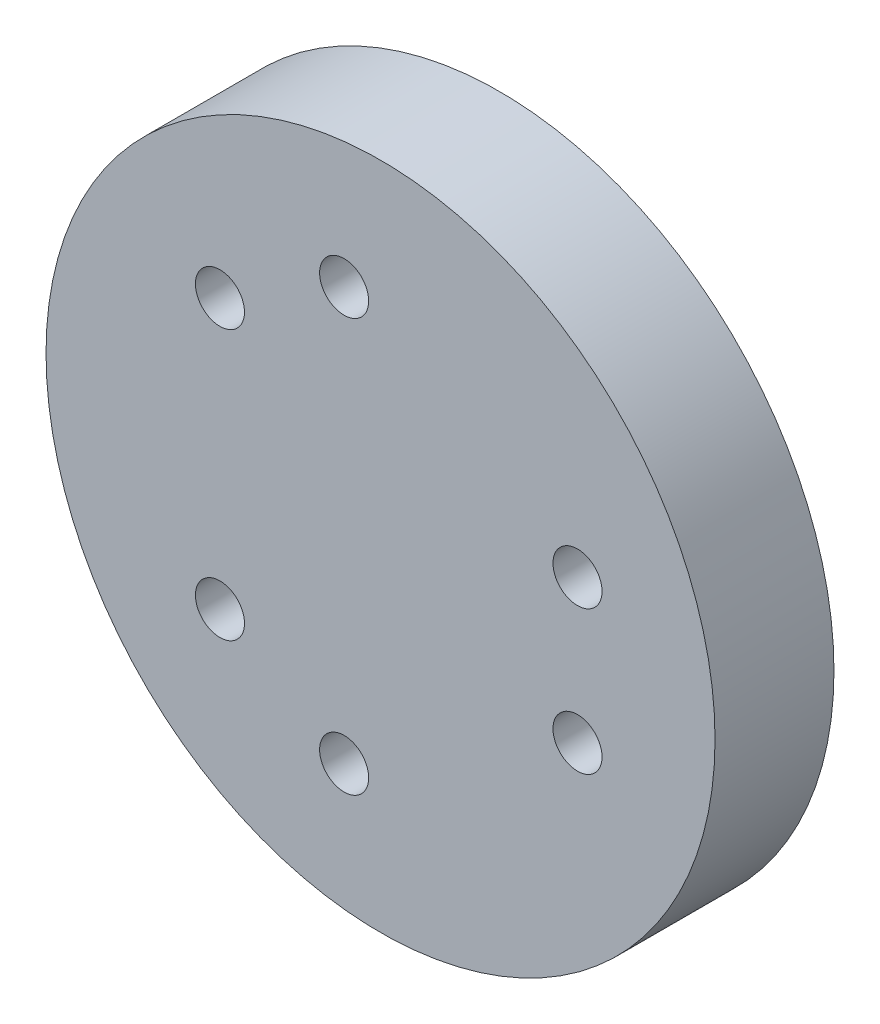
ISO-10303-21;
HEADER;
FILE_DESCRIPTION(('STEP AP214'),'2;1');
FILE_NAME('part.step','',(''),(''),'','','');
FILE_SCHEMA(('AUTOMOTIVE_DESIGN { 1 0 10303 214 1 1 1 1 }'));
ENDSEC;
DATA;
#1=APPLICATION_CONTEXT('core data for automotive mechanical design processes');
#2=APPLICATION_PROTOCOL_DEFINITION('international standard','automotive_design',2000,#1);
#3=PRODUCT_CONTEXT('',#1,'mechanical');
#4=PRODUCT('Part','Part','',(#3));
#5=PRODUCT_RELATED_PRODUCT_CATEGORY('part','',(#4));
#6=PRODUCT_DEFINITION_FORMATION('','',#4);
#7=PRODUCT_DEFINITION_CONTEXT('part definition',#1,'design');
#8=PRODUCT_DEFINITION('design','',#6,#7);
#9=PRODUCT_DEFINITION_SHAPE('','',#8);
#10=(LENGTH_UNIT() NAMED_UNIT(*) SI_UNIT(.MILLI.,.METRE.));
#11=(NAMED_UNIT(*) PLANE_ANGLE_UNIT() SI_UNIT($,.RADIAN.));
#12=(NAMED_UNIT(*) SI_UNIT($,.STERADIAN.) SOLID_ANGLE_UNIT());
#13=UNCERTAINTY_MEASURE_WITH_UNIT(LENGTH_MEASURE(1.E-05),#10,'distance_accuracy_value','');
#14=(GEOMETRIC_REPRESENTATION_CONTEXT(3) GLOBAL_UNCERTAINTY_ASSIGNED_CONTEXT((#13)) GLOBAL_UNIT_ASSIGNED_CONTEXT((#10,
#11,#12)) REPRESENTATION_CONTEXT('',''));
#15=CARTESIAN_POINT('',(0.,0.,0.));
#16=DIRECTION('',(0.,0.,1.));
#17=DIRECTION('',(1.,0.,0.));
#18=AXIS2_PLACEMENT_3D('',#15,#16,#17);
#19=CARTESIAN_POINT('',(0.,0.,10.));
#20=DIRECTION('',(0.,0.,-1.));
#21=DIRECTION('',(-1.,0.,0.));
#22=AXIS2_PLACEMENT_3D('',#19,#20,#21);
#23=CYLINDRICAL_SURFACE('',#22,22.5);
#24=CARTESIAN_POINT('',(0.,0.,10.));
#25=DIRECTION('',(0.,0.,1.));
#26=DIRECTION('',(1.,0.,0.));
#27=AXIS2_PLACEMENT_3D('',#24,#25,#26);
#28=CIRCLE('',#27,22.5);
#29=CARTESIAN_POINT('',(22.5,0.,10.));
#30=VERTEX_POINT('',#29);
#31=EDGE_CURVE('E10',#30,#30,#28,.T.);
#32=ORIENTED_EDGE('',*,*,#31,.F.);
#33=EDGE_LOOP('',(#32));
#34=FACE_BOUND('',#33,.T.);
#35=CARTESIAN_POINT('',(0.,0.,2.));
#36=DIRECTION('',(0.,0.,-1.));
#37=DIRECTION('',(-1.,0.,0.));
#38=AXIS2_PLACEMENT_3D('',#35,#36,#37);
#39=CIRCLE('',#38,22.5);
#40=CARTESIAN_POINT('',(-22.5,0.,2.));
#41=VERTEX_POINT('',#40);
#42=EDGE_CURVE('E140',#41,#41,#39,.T.);
#43=ORIENTED_EDGE('',*,*,#42,.F.);
#44=EDGE_LOOP('',(#43));
#45=FACE_BOUND('',#44,.T.);
#46=ADVANCED_FACE('F31',(#34,#45),#23,.T.);
#47=CARTESIAN_POINT('',(-2.44843930510373,13.8857893174721,7.));
#48=DIRECTION('',(0.,0.,-1.));
#49=DIRECTION('',(-1.,0.,0.));
#50=AXIS2_PLACEMENT_3D('',#47,#48,#49);
#51=CYLINDRICAL_SURFACE('',#50,3.);
#52=CARTESIAN_POINT('',(-2.44843930510373,13.8857893174721,7.));
#53=DIRECTION('',(0.,0.,-1.));
#54=DIRECTION('',(-1.,0.,0.));
#55=AXIS2_PLACEMENT_3D('',#52,#53,#54);
#56=CIRCLE('',#55,3.);
#57=CARTESIAN_POINT('',(-5.44843930510373,13.8857893174721,7.));
#58=VERTEX_POINT('',#57);
#59=EDGE_CURVE('E51',#58,#58,#56,.T.);
#60=ORIENTED_EDGE('',*,*,#59,.F.);
#61=EDGE_LOOP('',(#60));
#62=FACE_BOUND('',#61,.T.);
#63=CARTESIAN_POINT('',(-2.44843930510373,13.8857893174721,2.));
#64=DIRECTION('',(0.,0.,-1.));
#65=DIRECTION('',(-1.,0.,0.));
#66=AXIS2_PLACEMENT_3D('',#63,#64,#65);
#67=CIRCLE('',#66,3.);
#68=CARTESIAN_POINT('',(-5.44843930510373,13.8857893174721,2.));
#69=VERTEX_POINT('',#68);
#70=EDGE_CURVE('E147',#69,#69,#67,.T.);
#71=ORIENTED_EDGE('',*,*,#70,.T.);
#72=EDGE_LOOP('',(#71));
#73=FACE_BOUND('',#72,.T.);
#74=ADVANCED_FACE('F240',(#62,#73),#51,.F.);
#75=CARTESIAN_POINT('',(-2.44843930510205,-13.8857893174715,7.));
#76=DIRECTION('',(0.,0.,-1.));
#77=DIRECTION('',(-1.,0.,0.));
#78=AXIS2_PLACEMENT_3D('',#75,#76,#77);
#79=CYLINDRICAL_SURFACE('',#78,3.);
#80=CARTESIAN_POINT('',(-2.44843930510205,-13.8857893174715,7.));
#81=DIRECTION('',(0.,0.,-1.));
#82=DIRECTION('',(-1.,0.,0.));
#83=AXIS2_PLACEMENT_3D('',#80,#81,#82);
#84=CIRCLE('',#83,3.);
#85=CARTESIAN_POINT('',(-5.44843930510205,-13.8857893174715,7.));
#86=VERTEX_POINT('',#85);
#87=EDGE_CURVE('E115',#86,#86,#84,.T.);
#88=ORIENTED_EDGE('',*,*,#87,.F.);
#89=EDGE_LOOP('',(#88));
#90=FACE_BOUND('',#89,.T.);
#91=CARTESIAN_POINT('',(-2.44843930510205,-13.8857893174715,2.));
#92=DIRECTION('',(0.,0.,-1.));
#93=DIRECTION('',(-1.,0.,0.));
#94=AXIS2_PLACEMENT_3D('',#91,#92,#93);
#95=CIRCLE('',#94,3.);
#96=CARTESIAN_POINT('',(-5.44843930510205,-13.8857893174715,2.));
#97=VERTEX_POINT('',#96);
#98=EDGE_CURVE('E162',#97,#97,#95,.T.);
#99=ORIENTED_EDGE('',*,*,#98,.T.);
#100=EDGE_LOOP('',(#99));
#101=FACE_BOUND('',#100,.T.);
#102=ADVANCED_FACE('F245',(#90,#101),#79,.F.);
#103=CARTESIAN_POINT('',(-10.801226647976,-9.06330529657962,7.));
#104=DIRECTION('',(0.,0.,-1.));
#105=DIRECTION('',(-1.,0.,0.));
#106=AXIS2_PLACEMENT_3D('',#103,#104,#105);
#107=CYLINDRICAL_SURFACE('',#106,3.);
#108=CARTESIAN_POINT('',(-10.801226647976,-9.06330529657962,7.));
#109=DIRECTION('',(0.,0.,-1.));
#110=DIRECTION('',(-1.,0.,0.));
#111=AXIS2_PLACEMENT_3D('',#108,#109,#110);
#112=CIRCLE('',#111,3.);
#113=CARTESIAN_POINT('',(-13.801226647976,-9.06330529657962,7.));
#114=VERTEX_POINT('',#113);
#115=EDGE_CURVE('E117',#114,#114,#112,.T.);
#116=ORIENTED_EDGE('',*,*,#115,.F.);
#117=EDGE_LOOP('',(#116));
#118=FACE_BOUND('',#117,.T.);
#119=CARTESIAN_POINT('',(-10.801226647976,-9.06330529657962,2.));
#120=DIRECTION('',(0.,0.,-1.));
#121=DIRECTION('',(-1.,0.,0.));
#122=AXIS2_PLACEMENT_3D('',#119,#120,#121);
#123=CIRCLE('',#122,3.);
#124=CARTESIAN_POINT('',(-13.801226647976,-9.06330529657962,2.));
#125=VERTEX_POINT('',#124);
#126=EDGE_CURVE('E159',#125,#125,#123,.T.);
#127=ORIENTED_EDGE('',*,*,#126,.T.);
#128=EDGE_LOOP('',(#127));
#129=FACE_BOUND('',#128,.T.);
#130=ADVANCED_FACE('F251',(#118,#129),#107,.F.);
#131=CARTESIAN_POINT('',(13.2496659530816,4.82248402089367,7.));
#132=DIRECTION('',(0.,0.,-1.));
#133=DIRECTION('',(-1.,0.,0.));
#134=AXIS2_PLACEMENT_3D('',#131,#132,#133);
#135=CYLINDRICAL_SURFACE('',#134,3.);
#136=CARTESIAN_POINT('',(13.2496659530816,4.82248402089367,7.));
#137=DIRECTION('',(0.,0.,-1.));
#138=DIRECTION('',(-1.,0.,0.));
#139=AXIS2_PLACEMENT_3D('',#136,#137,#138);
#140=CIRCLE('',#139,3.);
#141=CARTESIAN_POINT('',(10.2496659530816,4.82248402089367,7.));
#142=VERTEX_POINT('',#141);
#143=EDGE_CURVE('E74',#142,#142,#140,.T.);
#144=ORIENTED_EDGE('',*,*,#143,.F.);
#145=EDGE_LOOP('',(#144));
#146=FACE_BOUND('',#145,.T.);
#147=CARTESIAN_POINT('',(13.2496659530816,4.82248402089367,2.));
#148=DIRECTION('',(0.,0.,-1.));
#149=DIRECTION('',(-1.,0.,0.));
#150=AXIS2_PLACEMENT_3D('',#147,#148,#149);
#151=CIRCLE('',#150,3.);
#152=CARTESIAN_POINT('',(10.2496659530816,4.82248402089367,2.));
#153=VERTEX_POINT('',#152);
#154=EDGE_CURVE('E174',#153,#153,#151,.T.);
#155=ORIENTED_EDGE('',*,*,#154,.T.);
#156=EDGE_LOOP('',(#155));
#157=FACE_BOUND('',#156,.T.);
#158=ADVANCED_FACE('F474',(#146,#157),#135,.F.);
#159=CARTESIAN_POINT('',(13.2496659530816,-4.82248402089022,7.));
#160=DIRECTION('',(0.,0.,-1.));
#161=DIRECTION('',(-1.,0.,0.));
#162=AXIS2_PLACEMENT_3D('',#159,#160,#161);
#163=CYLINDRICAL_SURFACE('',#162,3.);
#164=CARTESIAN_POINT('',(13.2496659530816,-4.82248402089022,7.));
#165=DIRECTION('',(0.,0.,-1.));
#166=DIRECTION('',(-1.,0.,0.));
#167=AXIS2_PLACEMENT_3D('',#164,#165,#166);
#168=CIRCLE('',#167,3.);
#169=CARTESIAN_POINT('',(10.2496659530816,-4.82248402089022,7.));
#170=VERTEX_POINT('',#169);
#171=EDGE_CURVE('E118',#170,#170,#168,.T.);
#172=ORIENTED_EDGE('',*,*,#171,.F.);
#173=EDGE_LOOP('',(#172));
#174=FACE_BOUND('',#173,.T.);
#175=CARTESIAN_POINT('',(13.2496659530816,-4.82248402089022,2.));
#176=DIRECTION('',(0.,0.,-1.));
#177=DIRECTION('',(-1.,0.,0.));
#178=AXIS2_PLACEMENT_3D('',#175,#176,#177);
#179=CIRCLE('',#178,3.);
#180=CARTESIAN_POINT('',(10.2496659530816,-4.82248402089022,2.));
#181=VERTEX_POINT('',#180);
#182=EDGE_CURVE('E171',#181,#181,#179,.T.);
#183=ORIENTED_EDGE('',*,*,#182,.T.);
#184=EDGE_LOOP('',(#183));
#185=FACE_BOUND('',#184,.T.);
#186=ADVANCED_FACE('F483',(#174,#185),#163,.F.);
#187=CARTESIAN_POINT('',(-10.8012266479776,9.06330529658017,7.));
#188=DIRECTION('',(0.,0.,-1.));
#189=DIRECTION('',(-1.,0.,0.));
#190=AXIS2_PLACEMENT_3D('',#187,#188,#189);
#191=CYLINDRICAL_SURFACE('',#190,3.);
#192=CARTESIAN_POINT('',(-10.8012266479776,9.06330529658017,7.));
#193=DIRECTION('',(0.,0.,-1.));
#194=DIRECTION('',(-1.,0.,0.));
#195=AXIS2_PLACEMENT_3D('',#192,#193,#194);
#196=CIRCLE('',#195,3.);
#197=CARTESIAN_POINT('',(-13.8012266479776,9.06330529658017,7.));
#198=VERTEX_POINT('',#197);
#199=EDGE_CURVE('E56',#198,#198,#196,.T.);
#200=ORIENTED_EDGE('',*,*,#199,.F.);
#201=EDGE_LOOP('',(#200));
#202=FACE_BOUND('',#201,.T.);
#203=CARTESIAN_POINT('',(-10.8012266479776,9.06330529658017,2.));
#204=DIRECTION('',(0.,0.,-1.));
#205=DIRECTION('',(-1.,0.,0.));
#206=AXIS2_PLACEMENT_3D('',#203,#204,#205);
#207=CIRCLE('',#206,3.);
#208=CARTESIAN_POINT('',(-13.8012266479776,9.06330529658017,2.));
#209=VERTEX_POINT('',#208);
#210=EDGE_CURVE('E150',#209,#209,#207,.T.);
#211=ORIENTED_EDGE('',*,*,#210,.T.);
#212=EDGE_LOOP('',(#211));
#213=FACE_BOUND('',#212,.T.);
#214=ADVANCED_FACE('F270',(#202,#213),#191,.F.);
#215=CARTESIAN_POINT('',(-10.8012266479776,9.06330529658017,10.));
#216=DIRECTION('',(0.,0.,-1.));
#217=DIRECTION('',(-1.,0.,0.));
#218=AXIS2_PLACEMENT_3D('',#215,#216,#217);
#219=CYLINDRICAL_SURFACE('',#218,1.65);
#220=CARTESIAN_POINT('',(-10.8012266479776,9.06330529658017,10.));
#221=DIRECTION('',(0.,0.,1.));
#222=DIRECTION('',(1.,0.,0.));
#223=AXIS2_PLACEMENT_3D('',#220,#221,#222);
#224=CIRCLE('',#223,1.65);
#225=CARTESIAN_POINT('',(-9.15122664797762,9.06330529658017,10.));
#226=VERTEX_POINT('',#225);
#227=EDGE_CURVE('E43',#226,#226,#224,.T.);
#228=ORIENTED_EDGE('',*,*,#227,.T.);
#229=EDGE_LOOP('',(#228));
#230=FACE_BOUND('',#229,.T.);
#231=CARTESIAN_POINT('',(-10.8012266479776,9.06330529658017,7.));
#232=DIRECTION('',(0.,0.,-1.));
#233=DIRECTION('',(-1.,0.,0.));
#234=AXIS2_PLACEMENT_3D('',#231,#232,#233);
#235=CIRCLE('',#234,1.65);
#236=CARTESIAN_POINT('',(-12.4512266479776,9.06330529658017,7.));
#237=VERTEX_POINT('',#236);
#238=EDGE_CURVE('E34',#237,#237,#235,.T.);
#239=ORIENTED_EDGE('',*,*,#238,.T.);
#240=EDGE_LOOP('',(#239));
#241=FACE_BOUND('',#240,.T.);
#242=ADVANCED_FACE('F89',(#230,#241),#219,.F.);
#243=CARTESIAN_POINT('',(13.2496659530816,-4.82248402089022,10.));
#244=DIRECTION('',(0.,0.,-1.));
#245=DIRECTION('',(-1.,0.,0.));
#246=AXIS2_PLACEMENT_3D('',#243,#244,#245);
#247=CYLINDRICAL_SURFACE('',#246,1.65);
#248=CARTESIAN_POINT('',(13.2496659530816,-4.82248402089022,10.));
#249=DIRECTION('',(0.,0.,1.));
#250=DIRECTION('',(1.,0.,0.));
#251=AXIS2_PLACEMENT_3D('',#248,#249,#250);
#252=CIRCLE('',#251,1.65);
#253=CARTESIAN_POINT('',(14.8996659530816,-4.82248402089022,10.));
#254=VERTEX_POINT('',#253);
#255=EDGE_CURVE('E84',#254,#254,#252,.T.);
#256=ORIENTED_EDGE('',*,*,#255,.T.);
#257=EDGE_LOOP('',(#256));
#258=FACE_BOUND('',#257,.T.);
#259=CARTESIAN_POINT('',(13.2496659530816,-4.82248402089022,7.));
#260=DIRECTION('',(0.,0.,-1.));
#261=DIRECTION('',(-1.,0.,0.));
#262=AXIS2_PLACEMENT_3D('',#259,#260,#261);
#263=CIRCLE('',#262,1.65);
#264=CARTESIAN_POINT('',(11.5996659530816,-4.82248402089022,7.));
#265=VERTEX_POINT('',#264);
#266=EDGE_CURVE('E61',#265,#265,#263,.T.);
#267=ORIENTED_EDGE('',*,*,#266,.T.);
#268=EDGE_LOOP('',(#267));
#269=FACE_BOUND('',#268,.T.);
#270=ADVANCED_FACE('F263',(#258,#269),#247,.F.);
#271=CARTESIAN_POINT('',(13.2496659530816,4.82248402089367,10.));
#272=DIRECTION('',(0.,0.,-1.));
#273=DIRECTION('',(-1.,0.,0.));
#274=AXIS2_PLACEMENT_3D('',#271,#272,#273);
#275=CYLINDRICAL_SURFACE('',#274,1.65);
#276=CARTESIAN_POINT('',(13.2496659530816,4.82248402089367,10.));
#277=DIRECTION('',(0.,0.,1.));
#278=DIRECTION('',(1.,0.,0.));
#279=AXIS2_PLACEMENT_3D('',#276,#277,#278);
#280=CIRCLE('',#279,1.65);
#281=CARTESIAN_POINT('',(14.8996659530816,4.82248402089367,10.));
#282=VERTEX_POINT('',#281);
#283=EDGE_CURVE('E81',#282,#282,#280,.T.);
#284=ORIENTED_EDGE('',*,*,#283,.T.);
#285=EDGE_LOOP('',(#284));
#286=FACE_BOUND('',#285,.T.);
#287=CARTESIAN_POINT('',(13.2496659530816,4.82248402089367,7.));
#288=DIRECTION('',(0.,0.,-1.));
#289=DIRECTION('',(-1.,0.,0.));
#290=AXIS2_PLACEMENT_3D('',#287,#288,#289);
#291=CIRCLE('',#290,1.65);
#292=CARTESIAN_POINT('',(11.5996659530816,4.82248402089367,7.));
#293=VERTEX_POINT('',#292);
#294=EDGE_CURVE('E59',#293,#293,#291,.T.);
#295=ORIENTED_EDGE('',*,*,#294,.T.);
#296=EDGE_LOOP('',(#295));
#297=FACE_BOUND('',#296,.T.);
#298=ADVANCED_FACE('F259',(#286,#297),#275,.F.);
#299=CARTESIAN_POINT('',(-10.801226647976,-9.06330529657962,10.));
#300=DIRECTION('',(0.,0.,-1.));
#301=DIRECTION('',(-1.,0.,0.));
#302=AXIS2_PLACEMENT_3D('',#299,#300,#301);
#303=CYLINDRICAL_SURFACE('',#302,1.65);
#304=CARTESIAN_POINT('',(-10.801226647976,-9.06330529657962,10.));
#305=DIRECTION('',(0.,0.,1.));
#306=DIRECTION('',(1.,0.,0.));
#307=AXIS2_PLACEMENT_3D('',#304,#305,#306);
#308=CIRCLE('',#307,1.65);
#309=CARTESIAN_POINT('',(-9.15122664797596,-9.06330529657962,10.));
#310=VERTEX_POINT('',#309);
#311=EDGE_CURVE('E78',#310,#310,#308,.T.);
#312=ORIENTED_EDGE('',*,*,#311,.T.);
#313=EDGE_LOOP('',(#312));
#314=FACE_BOUND('',#313,.T.);
#315=CARTESIAN_POINT('',(-10.801226647976,-9.06330529657962,7.));
#316=DIRECTION('',(0.,0.,-1.));
#317=DIRECTION('',(-1.,0.,0.));
#318=AXIS2_PLACEMENT_3D('',#315,#316,#317);
#319=CIRCLE('',#318,1.65);
#320=CARTESIAN_POINT('',(-12.451226647976,-9.06330529657962,7.));
#321=VERTEX_POINT('',#320);
#322=EDGE_CURVE('E55',#321,#321,#319,.T.);
#323=ORIENTED_EDGE('',*,*,#322,.T.);
#324=EDGE_LOOP('',(#323));
#325=FACE_BOUND('',#324,.T.);
#326=ADVANCED_FACE('F104',(#314,#325),#303,.F.);
#327=CARTESIAN_POINT('',(-2.44843930510205,-13.8857893174715,10.));
#328=DIRECTION('',(0.,0.,-1.));
#329=DIRECTION('',(-1.,0.,0.));
#330=AXIS2_PLACEMENT_3D('',#327,#328,#329);
#331=CYLINDRICAL_SURFACE('',#330,1.65);
#332=CARTESIAN_POINT('',(-2.44843930510205,-13.8857893174715,10.));
#333=DIRECTION('',(0.,0.,1.));
#334=DIRECTION('',(1.,0.,0.));
#335=AXIS2_PLACEMENT_3D('',#332,#333,#334);
#336=CIRCLE('',#335,1.65);
#337=CARTESIAN_POINT('',(-0.798439305102052,-13.8857893174715,10.));
#338=VERTEX_POINT('',#337);
#339=EDGE_CURVE('E50',#338,#338,#336,.T.);
#340=ORIENTED_EDGE('',*,*,#339,.T.);
#341=EDGE_LOOP('',(#340));
#342=FACE_BOUND('',#341,.T.);
#343=CARTESIAN_POINT('',(-2.44843930510205,-13.8857893174715,7.));
#344=DIRECTION('',(0.,0.,-1.));
#345=DIRECTION('',(-1.,0.,0.));
#346=AXIS2_PLACEMENT_3D('',#343,#344,#345);
#347=CIRCLE('',#346,1.65);
#348=CARTESIAN_POINT('',(-4.09843930510205,-13.8857893174715,7.));
#349=VERTEX_POINT('',#348);
#350=EDGE_CURVE('E52',#349,#349,#347,.T.);
#351=ORIENTED_EDGE('',*,*,#350,.T.);
#352=EDGE_LOOP('',(#351));
#353=FACE_BOUND('',#352,.T.);
#354=ADVANCED_FACE('F101',(#342,#353),#331,.F.);
#355=CARTESIAN_POINT('',(-2.44843930510373,13.8857893174721,10.));
#356=DIRECTION('',(0.,0.,-1.));
#357=DIRECTION('',(-1.,0.,0.));
#358=AXIS2_PLACEMENT_3D('',#355,#356,#357);
#359=CYLINDRICAL_SURFACE('',#358,1.65);
#360=CARTESIAN_POINT('',(-2.44843930510373,13.8857893174721,10.));
#361=DIRECTION('',(0.,0.,1.));
#362=DIRECTION('',(1.,0.,0.));
#363=AXIS2_PLACEMENT_3D('',#360,#361,#362);
#364=CIRCLE('',#363,1.65);
#365=CARTESIAN_POINT('',(-0.798439305103731,13.8857893174721,10.));
#366=VERTEX_POINT('',#365);
#367=EDGE_CURVE('E38',#366,#366,#364,.T.);
#368=ORIENTED_EDGE('',*,*,#367,.T.);
#369=EDGE_LOOP('',(#368));
#370=FACE_BOUND('',#369,.T.);
#371=CARTESIAN_POINT('',(-2.44843930510373,13.8857893174721,7.));
#372=DIRECTION('',(0.,0.,-1.));
#373=DIRECTION('',(-1.,0.,0.));
#374=AXIS2_PLACEMENT_3D('',#371,#372,#373);
#375=CIRCLE('',#374,1.65);
#376=CARTESIAN_POINT('',(-4.09843930510373,13.8857893174721,7.));
#377=VERTEX_POINT('',#376);
#378=EDGE_CURVE('E47',#377,#377,#375,.T.);
#379=ORIENTED_EDGE('',*,*,#378,.T.);
#380=EDGE_LOOP('',(#379));
#381=FACE_BOUND('',#380,.T.);
#382=ADVANCED_FACE('F95',(#370,#381),#359,.F.);
#383=CARTESIAN_POINT('',(0.,0.,10.));
#384=DIRECTION('',(0.,0.,1.));
#385=DIRECTION('',(1.,0.,0.));
#386=AXIS2_PLACEMENT_3D('',#383,#384,#385);
#387=PLANE('',#386);
#388=ORIENTED_EDGE('',*,*,#311,.F.);
#389=EDGE_LOOP('',(#388));
#390=FACE_BOUND('',#389,.T.);
#391=ORIENTED_EDGE('',*,*,#255,.F.);
#392=EDGE_LOOP('',(#391));
#393=FACE_BOUND('',#392,.T.);
#394=ORIENTED_EDGE('',*,*,#367,.F.);
#395=EDGE_LOOP('',(#394));
#396=FACE_BOUND('',#395,.T.);
#397=ORIENTED_EDGE('',*,*,#31,.T.);
#398=EDGE_LOOP('',(#397));
#399=FACE_BOUND('',#398,.T.);
#400=ORIENTED_EDGE('',*,*,#227,.F.);
#401=EDGE_LOOP('',(#400));
#402=FACE_BOUND('',#401,.T.);
#403=ORIENTED_EDGE('',*,*,#283,.F.);
#404=EDGE_LOOP('',(#403));
#405=FACE_BOUND('',#404,.T.);
#406=ORIENTED_EDGE('',*,*,#339,.F.);
#407=EDGE_LOOP('',(#406));
#408=FACE_BOUND('',#407,.T.);
#409=ADVANCED_FACE('F91',(#390,#393,#396,#399,#402,#405,#408),#387,.T.);
#410=CARTESIAN_POINT('',(-2.44843930510373,13.8857893174721,7.));
#411=DIRECTION('',(0.,0.,-1.));
#412=DIRECTION('',(-1.,0.,0.));
#413=AXIS2_PLACEMENT_3D('',#410,#411,#412);
#414=PLANE('',#413);
#415=ORIENTED_EDGE('',*,*,#378,.F.);
#416=EDGE_LOOP('',(#415));
#417=FACE_BOUND('',#416,.T.);
#418=ORIENTED_EDGE('',*,*,#59,.T.);
#419=EDGE_LOOP('',(#418));
#420=FACE_BOUND('',#419,.T.);
#421=ADVANCED_FACE('F94',(#417,#420),#414,.T.);
#422=CARTESIAN_POINT('',(-2.44843930510205,-13.8857893174715,7.));
#423=DIRECTION('',(0.,0.,-1.));
#424=DIRECTION('',(-1.,0.,0.));
#425=AXIS2_PLACEMENT_3D('',#422,#423,#424);
#426=PLANE('',#425);
#427=ORIENTED_EDGE('',*,*,#350,.F.);
#428=EDGE_LOOP('',(#427));
#429=FACE_BOUND('',#428,.T.);
#430=ORIENTED_EDGE('',*,*,#87,.T.);
#431=EDGE_LOOP('',(#430));
#432=FACE_BOUND('',#431,.T.);
#433=ADVANCED_FACE('F108',(#429,#432),#426,.T.);
#434=CARTESIAN_POINT('',(-10.801226647976,-9.06330529657962,7.));
#435=DIRECTION('',(0.,0.,-1.));
#436=DIRECTION('',(-1.,0.,0.));
#437=AXIS2_PLACEMENT_3D('',#434,#435,#436);
#438=PLANE('',#437);
#439=ORIENTED_EDGE('',*,*,#322,.F.);
#440=EDGE_LOOP('',(#439));
#441=FACE_BOUND('',#440,.T.);
#442=ORIENTED_EDGE('',*,*,#115,.T.);
#443=EDGE_LOOP('',(#442));
#444=FACE_BOUND('',#443,.T.);
#445=ADVANCED_FACE('F111',(#441,#444),#438,.T.);
#446=CARTESIAN_POINT('',(13.2496659530816,4.82248402089367,7.));
#447=DIRECTION('',(0.,0.,-1.));
#448=DIRECTION('',(-1.,0.,0.));
#449=AXIS2_PLACEMENT_3D('',#446,#447,#448);
#450=PLANE('',#449);
#451=ORIENTED_EDGE('',*,*,#294,.F.);
#452=EDGE_LOOP('',(#451));
#453=FACE_BOUND('',#452,.T.);
#454=ORIENTED_EDGE('',*,*,#143,.T.);
#455=EDGE_LOOP('',(#454));
#456=FACE_BOUND('',#455,.T.);
#457=ADVANCED_FACE('F294',(#453,#456),#450,.T.);
#458=CARTESIAN_POINT('',(13.2496659530816,-4.82248402089022,7.));
#459=DIRECTION('',(0.,0.,-1.));
#460=DIRECTION('',(-1.,0.,0.));
#461=AXIS2_PLACEMENT_3D('',#458,#459,#460);
#462=PLANE('',#461);
#463=ORIENTED_EDGE('',*,*,#266,.F.);
#464=EDGE_LOOP('',(#463));
#465=FACE_BOUND('',#464,.T.);
#466=ORIENTED_EDGE('',*,*,#171,.T.);
#467=EDGE_LOOP('',(#466));
#468=FACE_BOUND('',#467,.T.);
#469=ADVANCED_FACE('F302',(#465,#468),#462,.T.);
#470=CARTESIAN_POINT('',(-10.8012266479776,9.06330529658017,7.));
#471=DIRECTION('',(0.,0.,-1.));
#472=DIRECTION('',(-1.,0.,0.));
#473=AXIS2_PLACEMENT_3D('',#470,#471,#472);
#474=PLANE('',#473);
#475=ORIENTED_EDGE('',*,*,#238,.F.);
#476=EDGE_LOOP('',(#475));
#477=FACE_BOUND('',#476,.T.);
#478=ORIENTED_EDGE('',*,*,#199,.T.);
#479=EDGE_LOOP('',(#478));
#480=FACE_BOUND('',#479,.T.);
#481=ADVANCED_FACE('F209',(#477,#480),#474,.T.);
#482=CARTESIAN_POINT('',(0.,0.,2.));
#483=DIRECTION('',(0.,0.,-1.));
#484=DIRECTION('',(-1.,0.,0.));
#485=AXIS2_PLACEMENT_3D('',#482,#483,#484);
#486=PLANE('',#485);
#487=CARTESIAN_POINT('',(0.,-5.6,2.));
#488=DIRECTION('',(0.,0.,-1.));
#489=DIRECTION('',(-1.,0.,0.));
#490=AXIS2_PLACEMENT_3D('',#487,#488,#489);
#491=CIRCLE('',#490,1.);
#492=CARTESIAN_POINT('',(-1.,-5.6,2.));
#493=VERTEX_POINT('',#492);
#494=EDGE_CURVE('E190',#493,#493,#491,.T.);
#495=ORIENTED_EDGE('',*,*,#494,.F.);
#496=EDGE_LOOP('',(#495));
#497=FACE_BOUND('',#496,.T.);
#498=CARTESIAN_POINT('',(0.,5.6,2.));
#499=DIRECTION('',(0.,0.,-1.));
#500=DIRECTION('',(-1.,0.,0.));
#501=AXIS2_PLACEMENT_3D('',#498,#499,#500);
#502=CIRCLE('',#501,1.);
#503=CARTESIAN_POINT('',(-1.,5.6,2.));
#504=VERTEX_POINT('',#503);
#505=EDGE_CURVE('E184',#504,#504,#502,.T.);
#506=ORIENTED_EDGE('',*,*,#505,.F.);
#507=EDGE_LOOP('',(#506));
#508=FACE_BOUND('',#507,.T.);
#509=CARTESIAN_POINT('',(3.31465056500655,12.0525139133661,2.));
#510=DIRECTION('',(0.,0.,-1.));
#511=DIRECTION('',(-1.,0.,0.));
#512=AXIS2_PLACEMENT_3D('',#509,#510,#511);
#513=CIRCLE('',#512,1.1);
#514=CARTESIAN_POINT('',(2.21465056500655,12.0525139133661,2.));
#515=VERTEX_POINT('',#514);
#516=EDGE_CURVE('E180',#515,#515,#513,.T.);
#517=ORIENTED_EDGE('',*,*,#516,.F.);
#518=EDGE_LOOP('',(#517));
#519=FACE_BOUND('',#518,.T.);
#520=CARTESIAN_POINT('',(8.89682855064762,8.78045794593712,2.));
#521=DIRECTION('',(0.,0.,-1.));
#522=DIRECTION('',(-1.,0.,0.));
#523=AXIS2_PLACEMENT_3D('',#520,#521,#522);
#524=CIRCLE('',#523,1.1);
#525=CARTESIAN_POINT('',(7.79682855064762,8.78045794593712,2.));
#526=VERTEX_POINT('',#525);
#527=EDGE_CURVE('E177',#526,#526,#524,.T.);
#528=ORIENTED_EDGE('',*,*,#527,.F.);
#529=EDGE_LOOP('',(#528));
#530=FACE_BOUND('',#529,.T.);
#531=ORIENTED_EDGE('',*,*,#154,.F.);
#532=EDGE_LOOP('',(#531));
#533=FACE_BOUND('',#532,.T.);
#534=ORIENTED_EDGE('',*,*,#182,.F.);
#535=EDGE_LOOP('',(#534));
#536=FACE_BOUND('',#535,.T.);
#537=CARTESIAN_POINT('',(8.78045794593737,-8.89682855064802,2.));
#538=DIRECTION('',(0.,0.,-1.));
#539=DIRECTION('',(-1.,0.,0.));
#540=AXIS2_PLACEMENT_3D('',#537,#538,#539);
#541=CIRCLE('',#540,1.1);
#542=CARTESIAN_POINT('',(7.68045794593736,-8.89682855064802,2.));
#543=VERTEX_POINT('',#542);
#544=EDGE_CURVE('E168',#543,#543,#541,.T.);
#545=ORIENTED_EDGE('',*,*,#544,.F.);
#546=EDGE_LOOP('',(#545));
#547=FACE_BOUND('',#546,.T.);
#548=CARTESIAN_POINT('',(3.1556853627189,-12.095108510945,2.));
#549=DIRECTION('',(0.,0.,-1.));
#550=DIRECTION('',(-1.,0.,0.));
#551=AXIS2_PLACEMENT_3D('',#548,#549,#550);
#552=CIRCLE('',#551,1.1);
#553=CARTESIAN_POINT('',(2.0556853627189,-12.095108510945,2.));
#554=VERTEX_POINT('',#553);
#555=EDGE_CURVE('E165',#554,#554,#552,.T.);
#556=ORIENTED_EDGE('',*,*,#555,.F.);
#557=EDGE_LOOP('',(#556));
#558=FACE_BOUND('',#557,.T.);
#559=ORIENTED_EDGE('',*,*,#98,.F.);
#560=EDGE_LOOP('',(#559));
#561=FACE_BOUND('',#560,.T.);
#562=ORIENTED_EDGE('',*,*,#126,.F.);
#563=EDGE_LOOP('',(#562));
#564=FACE_BOUND('',#563,.T.);
#565=CARTESIAN_POINT('',(-12.0951085109443,-3.15568536271956,2.));
#566=DIRECTION('',(0.,0.,-1.));
#567=DIRECTION('',(-1.,0.,0.));
#568=AXIS2_PLACEMENT_3D('',#565,#566,#567);
#569=CIRCLE('',#568,1.1);
#570=CARTESIAN_POINT('',(-13.1951085109443,-3.15568536271956,2.));
#571=VERTEX_POINT('',#570);
#572=EDGE_CURVE('E156',#571,#571,#569,.T.);
#573=ORIENTED_EDGE('',*,*,#572,.F.);
#574=EDGE_LOOP('',(#573));
#575=FACE_BOUND('',#574,.T.);
#576=CARTESIAN_POINT('',(-12.0525139133669,3.31465056500633,2.));
#577=DIRECTION('',(0.,0.,-1.));
#578=DIRECTION('',(-1.,0.,0.));
#579=AXIS2_PLACEMENT_3D('',#576,#577,#578);
#580=CIRCLE('',#579,1.1);
#581=CARTESIAN_POINT('',(-13.1525139133669,3.31465056500633,2.));
#582=VERTEX_POINT('',#581);
#583=EDGE_CURVE('E153',#582,#582,#580,.T.);
#584=ORIENTED_EDGE('',*,*,#583,.F.);
#585=EDGE_LOOP('',(#584));
#586=FACE_BOUND('',#585,.T.);
#587=ORIENTED_EDGE('',*,*,#210,.F.);
#588=EDGE_LOOP('',(#587));
#589=FACE_BOUND('',#588,.T.);
#590=ORIENTED_EDGE('',*,*,#70,.F.);
#591=EDGE_LOOP('',(#590));
#592=FACE_BOUND('',#591,.T.);
#593=ORIENTED_EDGE('',*,*,#42,.T.);
#594=EDGE_LOOP('',(#593));
#595=FACE_BOUND('',#594,.T.);
#596=ADVANCED_FACE('F205',(#497,#508,#519,#530,#533,#536,#547,#558,#561,#564,#575,#586,#589,
#592,#595),#486,.T.);
#597=CARTESIAN_POINT('',(8.89682855064762,8.78045794593712,8.));
#598=DIRECTION('',(0.,0.,-1.));
#599=DIRECTION('',(-1.,0.,0.));
#600=AXIS2_PLACEMENT_3D('',#597,#598,#599);
#601=PLANE('',#600);
#602=CARTESIAN_POINT('',(8.89682855064762,8.78045794593712,8.));
#603=DIRECTION('',(0.,0.,-1.));
#604=DIRECTION('',(-1.,0.,0.));
#605=AXIS2_PLACEMENT_3D('',#602,#603,#604);
#606=CIRCLE('',#605,1.1);
#607=CARTESIAN_POINT('',(7.79682855064762,8.78045794593712,8.));
#608=VERTEX_POINT('',#607);
#609=EDGE_CURVE('E139',#608,#608,#606,.T.);
#610=ORIENTED_EDGE('',*,*,#609,.T.);
#611=EDGE_LOOP('',(#610));
#612=FACE_BOUND('',#611,.T.);
#613=ADVANCED_FACE('F208',(#612),#601,.T.);
#614=CARTESIAN_POINT('',(8.89682855064762,8.78045794593712,8.));
#615=DIRECTION('',(0.,0.,-1.));
#616=DIRECTION('',(-1.,0.,0.));
#617=AXIS2_PLACEMENT_3D('',#614,#615,#616);
#618=CYLINDRICAL_SURFACE('',#617,1.1);
#619=ORIENTED_EDGE('',*,*,#609,.F.);
#620=EDGE_LOOP('',(#619));
#621=FACE_BOUND('',#620,.T.);
#622=ORIENTED_EDGE('',*,*,#527,.T.);
#623=EDGE_LOOP('',(#622));
#624=FACE_BOUND('',#623,.T.);
#625=ADVANCED_FACE('F331',(#621,#624),#618,.F.);
#626=CARTESIAN_POINT('',(8.78045794593737,-8.89682855064802,8.));
#627=DIRECTION('',(0.,0.,-1.));
#628=DIRECTION('',(-1.,0.,0.));
#629=AXIS2_PLACEMENT_3D('',#626,#627,#628);
#630=PLANE('',#629);
#631=CARTESIAN_POINT('',(8.78045794593737,-8.89682855064802,8.));
#632=DIRECTION('',(0.,0.,-1.));
#633=DIRECTION('',(-1.,0.,0.));
#634=AXIS2_PLACEMENT_3D('',#631,#632,#633);
#635=CIRCLE('',#634,1.1);
#636=CARTESIAN_POINT('',(7.68045794593736,-8.89682855064802,8.));
#637=VERTEX_POINT('',#636);
#638=EDGE_CURVE('E133',#637,#637,#635,.T.);
#639=ORIENTED_EDGE('',*,*,#638,.T.);
#640=EDGE_LOOP('',(#639));
#641=FACE_BOUND('',#640,.T.);
#642=ADVANCED_FACE('F341',(#641),#630,.T.);
#643=CARTESIAN_POINT('',(8.78045794593737,-8.89682855064802,8.));
#644=DIRECTION('',(0.,0.,-1.));
#645=DIRECTION('',(-1.,0.,0.));
#646=AXIS2_PLACEMENT_3D('',#643,#644,#645);
#647=CYLINDRICAL_SURFACE('',#646,1.1);
#648=ORIENTED_EDGE('',*,*,#638,.F.);
#649=EDGE_LOOP('',(#648));
#650=FACE_BOUND('',#649,.T.);
#651=ORIENTED_EDGE('',*,*,#544,.T.);
#652=EDGE_LOOP('',(#651));
#653=FACE_BOUND('',#652,.T.);
#654=ADVANCED_FACE('F350',(#650,#653),#647,.F.);
#655=CARTESIAN_POINT('',(3.1556853627189,-12.095108510945,8.));
#656=DIRECTION('',(0.,0.,-1.));
#657=DIRECTION('',(-1.,0.,0.));
#658=AXIS2_PLACEMENT_3D('',#655,#656,#657);
#659=PLANE('',#658);
#660=CARTESIAN_POINT('',(3.1556853627189,-12.095108510945,8.));
#661=DIRECTION('',(0.,0.,-1.));
#662=DIRECTION('',(-1.,0.,0.));
#663=AXIS2_PLACEMENT_3D('',#660,#661,#662);
#664=CIRCLE('',#663,1.1);
#665=CARTESIAN_POINT('',(2.0556853627189,-12.095108510945,8.));
#666=VERTEX_POINT('',#665);
#667=EDGE_CURVE('E130',#666,#666,#664,.T.);
#668=ORIENTED_EDGE('',*,*,#667,.T.);
#669=EDGE_LOOP('',(#668));
#670=FACE_BOUND('',#669,.T.);
#671=ADVANCED_FACE('F358',(#670),#659,.T.);
#672=CARTESIAN_POINT('',(3.1556853627189,-12.095108510945,8.));
#673=DIRECTION('',(0.,0.,-1.));
#674=DIRECTION('',(-1.,0.,0.));
#675=AXIS2_PLACEMENT_3D('',#672,#673,#674);
#676=CYLINDRICAL_SURFACE('',#675,1.1);
#677=ORIENTED_EDGE('',*,*,#667,.F.);
#678=EDGE_LOOP('',(#677));
#679=FACE_BOUND('',#678,.T.);
#680=ORIENTED_EDGE('',*,*,#555,.T.);
#681=EDGE_LOOP('',(#680));
#682=FACE_BOUND('',#681,.T.);
#683=ADVANCED_FACE('F366',(#679,#682),#676,.F.);
#684=CARTESIAN_POINT('',(-12.0951085109443,-3.15568536271956,8.));
#685=DIRECTION('',(0.,0.,-1.));
#686=DIRECTION('',(-1.,0.,0.));
#687=AXIS2_PLACEMENT_3D('',#684,#685,#686);
#688=PLANE('',#687);
#689=CARTESIAN_POINT('',(-12.0951085109443,-3.15568536271956,8.));
#690=DIRECTION('',(0.,0.,-1.));
#691=DIRECTION('',(-1.,0.,0.));
#692=AXIS2_PLACEMENT_3D('',#689,#690,#691);
#693=CIRCLE('',#692,1.1);
#694=CARTESIAN_POINT('',(-13.1951085109443,-3.15568536271956,8.));
#695=VERTEX_POINT('',#694);
#696=EDGE_CURVE('E129',#695,#695,#693,.T.);
#697=ORIENTED_EDGE('',*,*,#696,.T.);
#698=EDGE_LOOP('',(#697));
#699=FACE_BOUND('',#698,.T.);
#700=ADVANCED_FACE('F374',(#699),#688,.T.);
#701=CARTESIAN_POINT('',(-12.0951085109443,-3.15568536271956,8.));
#702=DIRECTION('',(0.,0.,-1.));
#703=DIRECTION('',(-1.,0.,0.));
#704=AXIS2_PLACEMENT_3D('',#701,#702,#703);
#705=CYLINDRICAL_SURFACE('',#704,1.1);
#706=ORIENTED_EDGE('',*,*,#696,.F.);
#707=EDGE_LOOP('',(#706));
#708=FACE_BOUND('',#707,.T.);
#709=ORIENTED_EDGE('',*,*,#572,.T.);
#710=EDGE_LOOP('',(#709));
#711=FACE_BOUND('',#710,.T.);
#712=ADVANCED_FACE('F382',(#708,#711),#705,.F.);
#713=CARTESIAN_POINT('',(-12.0525139133669,3.31465056500633,8.));
#714=DIRECTION('',(0.,0.,-1.));
#715=DIRECTION('',(-1.,0.,0.));
#716=AXIS2_PLACEMENT_3D('',#713,#714,#715);
#717=PLANE('',#716);
#718=CARTESIAN_POINT('',(-12.0525139133669,3.31465056500633,8.));
#719=DIRECTION('',(0.,0.,-1.));
#720=DIRECTION('',(-1.,0.,0.));
#721=AXIS2_PLACEMENT_3D('',#718,#719,#720);
#722=CIRCLE('',#721,1.1);
#723=CARTESIAN_POINT('',(-13.1525139133669,3.31465056500633,8.));
#724=VERTEX_POINT('',#723);
#725=EDGE_CURVE('E126',#724,#724,#722,.T.);
#726=ORIENTED_EDGE('',*,*,#725,.T.);
#727=EDGE_LOOP('',(#726));
#728=FACE_BOUND('',#727,.T.);
#729=ADVANCED_FACE('F389',(#728),#717,.T.);
#730=CARTESIAN_POINT('',(-12.0525139133669,3.31465056500633,8.));
#731=DIRECTION('',(0.,0.,-1.));
#732=DIRECTION('',(-1.,0.,0.));
#733=AXIS2_PLACEMENT_3D('',#730,#731,#732);
#734=CYLINDRICAL_SURFACE('',#733,1.1);
#735=ORIENTED_EDGE('',*,*,#725,.F.);
#736=EDGE_LOOP('',(#735));
#737=FACE_BOUND('',#736,.T.);
#738=ORIENTED_EDGE('',*,*,#583,.T.);
#739=EDGE_LOOP('',(#738));
#740=FACE_BOUND('',#739,.T.);
#741=ADVANCED_FACE('F397',(#737,#740),#734,.F.);
#742=CARTESIAN_POINT('',(3.31465056500655,12.0525139133661,8.));
#743=DIRECTION('',(0.,0.,-1.));
#744=DIRECTION('',(-1.,0.,0.));
#745=AXIS2_PLACEMENT_3D('',#742,#743,#744);
#746=PLANE('',#745);
#747=CARTESIAN_POINT('',(3.31465056500655,12.0525139133661,8.));
#748=DIRECTION('',(0.,0.,-1.));
#749=DIRECTION('',(-1.,0.,0.));
#750=AXIS2_PLACEMENT_3D('',#747,#748,#749);
#751=CIRCLE('',#750,1.1);
#752=CARTESIAN_POINT('',(2.21465056500655,12.0525139133661,8.));
#753=VERTEX_POINT('',#752);
#754=EDGE_CURVE('E136',#753,#753,#751,.T.);
#755=ORIENTED_EDGE('',*,*,#754,.T.);
#756=EDGE_LOOP('',(#755));
#757=FACE_BOUND('',#756,.T.);
#758=ADVANCED_FACE('F404',(#757),#746,.T.);
#759=CARTESIAN_POINT('',(3.31465056500655,12.0525139133661,8.));
#760=DIRECTION('',(0.,0.,-1.));
#761=DIRECTION('',(-1.,0.,0.));
#762=AXIS2_PLACEMENT_3D('',#759,#760,#761);
#763=CYLINDRICAL_SURFACE('',#762,1.1);
#764=ORIENTED_EDGE('',*,*,#754,.F.);
#765=EDGE_LOOP('',(#764));
#766=FACE_BOUND('',#765,.T.);
#767=ORIENTED_EDGE('',*,*,#516,.T.);
#768=EDGE_LOOP('',(#767));
#769=FACE_BOUND('',#768,.T.);
#770=ADVANCED_FACE('F411',(#766,#769),#763,.F.);
#771=CARTESIAN_POINT('',(0.,5.6,4.));
#772=DIRECTION('',(0.,0.,-1.));
#773=DIRECTION('',(-1.,0.,0.));
#774=AXIS2_PLACEMENT_3D('',#771,#772,#773);
#775=CYLINDRICAL_SURFACE('',#774,1.);
#776=CARTESIAN_POINT('',(0.,5.6,4.));
#777=DIRECTION('',(0.,0.,-1.));
#778=DIRECTION('',(-1.,0.,0.));
#779=AXIS2_PLACEMENT_3D('',#776,#777,#778);
#780=CIRCLE('',#779,1.);
#781=CARTESIAN_POINT('',(-1.,5.6,4.));
#782=VERTEX_POINT('',#781);
#783=EDGE_CURVE('E183',#782,#782,#780,.T.);
#784=ORIENTED_EDGE('',*,*,#783,.F.);
#785=EDGE_LOOP('',(#784));
#786=FACE_BOUND('',#785,.T.);
#787=ORIENTED_EDGE('',*,*,#505,.T.);
#788=EDGE_LOOP('',(#787));
#789=FACE_BOUND('',#788,.T.);
#790=ADVANCED_FACE('F418',(#786,#789),#775,.F.);
#791=CARTESIAN_POINT('',(0.,5.6,4.));
#792=DIRECTION('',(0.,0.,-1.));
#793=DIRECTION('',(-1.,0.,0.));
#794=AXIS2_PLACEMENT_3D('',#791,#792,#793);
#795=PLANE('',#794);
#796=ORIENTED_EDGE('',*,*,#783,.T.);
#797=EDGE_LOOP('',(#796));
#798=FACE_BOUND('',#797,.T.);
#799=ADVANCED_FACE('F201',(#798),#795,.T.);
#800=CARTESIAN_POINT('',(0.,-5.6,4.));
#801=DIRECTION('',(0.,0.,-1.));
#802=DIRECTION('',(-1.,0.,0.));
#803=AXIS2_PLACEMENT_3D('',#800,#801,#802);
#804=CYLINDRICAL_SURFACE('',#803,1.);
#805=CARTESIAN_POINT('',(0.,-5.6,4.));
#806=DIRECTION('',(0.,0.,-1.));
#807=DIRECTION('',(-1.,0.,0.));
#808=AXIS2_PLACEMENT_3D('',#805,#806,#807);
#809=CIRCLE('',#808,1.);
#810=CARTESIAN_POINT('',(-1.,-5.6,4.));
#811=VERTEX_POINT('',#810);
#812=EDGE_CURVE('E187',#811,#811,#809,.T.);
#813=ORIENTED_EDGE('',*,*,#812,.F.);
#814=EDGE_LOOP('',(#813));
#815=FACE_BOUND('',#814,.T.);
#816=ORIENTED_EDGE('',*,*,#494,.T.);
#817=EDGE_LOOP('',(#816));
#818=FACE_BOUND('',#817,.T.);
#819=ADVANCED_FACE('F198',(#815,#818),#804,.F.);
#820=CARTESIAN_POINT('',(0.,-5.6,4.));
#821=DIRECTION('',(0.,0.,-1.));
#822=DIRECTION('',(-1.,0.,0.));
#823=AXIS2_PLACEMENT_3D('',#820,#821,#822);
#824=PLANE('',#823);
#825=ORIENTED_EDGE('',*,*,#812,.T.);
#826=EDGE_LOOP('',(#825));
#827=FACE_BOUND('',#826,.T.);
#828=ADVANCED_FACE('F196',(#827),#824,.T.);
#829=CLOSED_SHELL('',(#46,#74,#102,#130,#158,#186,#214,#242,#270,#298,#326,#354,#382,#409,#421,
#433,#445,#457,#469,#481,#596,#613,#625,#642,#654,#671,#683,#700,#712,#729,#741,#758,#770,#790,
#799,#819,#828));
#830=MANIFOLD_SOLID_BREP('B2',#829);
#831=ADVANCED_BREP_SHAPE_REPRESENTATION('',(#18,#830),#14);
#832=SHAPE_DEFINITION_REPRESENTATION(#9,#831);
ENDSEC;
END-ISO-10303-21;
